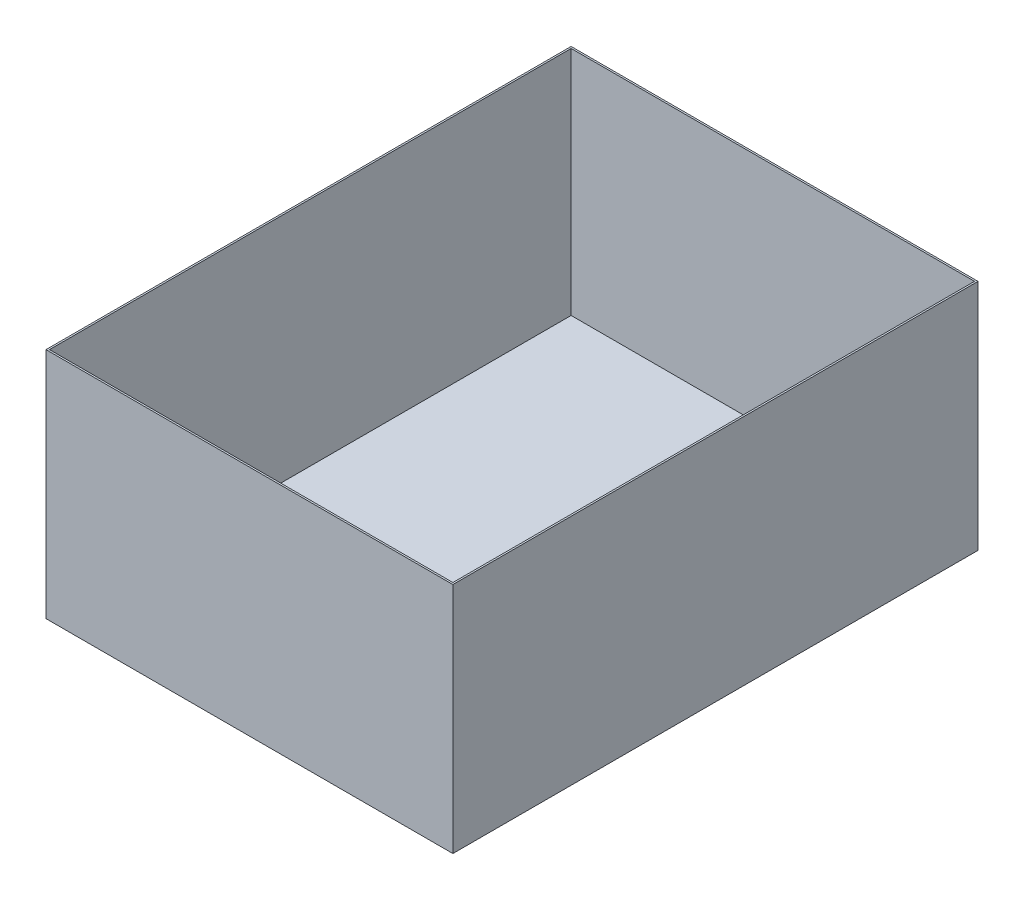
ISO-10303-21;
HEADER;
FILE_DESCRIPTION(('STEP AP214'),'2;1');
FILE_NAME('part.step','',(''),(''),'','','');
FILE_SCHEMA(('AUTOMOTIVE_DESIGN { 1 0 10303 214 1 1 1 1 }'));
ENDSEC;
DATA;
#1=APPLICATION_CONTEXT('core data for automotive mechanical design processes');
#2=APPLICATION_PROTOCOL_DEFINITION('international standard','automotive_design',2000,#1);
#3=PRODUCT_CONTEXT('',#1,'mechanical');
#4=PRODUCT('Part','Part','',(#3));
#5=PRODUCT_RELATED_PRODUCT_CATEGORY('part','',(#4));
#6=PRODUCT_DEFINITION_FORMATION('','',#4);
#7=PRODUCT_DEFINITION_CONTEXT('part definition',#1,'design');
#8=PRODUCT_DEFINITION('design','',#6,#7);
#9=PRODUCT_DEFINITION_SHAPE('','',#8);
#10=(LENGTH_UNIT() NAMED_UNIT(*) SI_UNIT(.MILLI.,.METRE.));
#11=(NAMED_UNIT(*) PLANE_ANGLE_UNIT() SI_UNIT($,.RADIAN.));
#12=(NAMED_UNIT(*) SI_UNIT($,.STERADIAN.) SOLID_ANGLE_UNIT());
#13=UNCERTAINTY_MEASURE_WITH_UNIT(LENGTH_MEASURE(1.E-05),#10,'distance_accuracy_value','');
#14=(GEOMETRIC_REPRESENTATION_CONTEXT(3) GLOBAL_UNCERTAINTY_ASSIGNED_CONTEXT((#13)) GLOBAL_UNIT_ASSIGNED_CONTEXT((#10,
#11,#12)) REPRESENTATION_CONTEXT('',''));
#15=CARTESIAN_POINT('',(0.,0.,0.));
#16=DIRECTION('',(0.,0.,1.));
#17=DIRECTION('',(1.,0.,0.));
#18=AXIS2_PLACEMENT_3D('',#15,#16,#17);
#19=CARTESIAN_POINT('',(58.5,33.5,-75.5));
#20=DIRECTION('',(-1.,0.,0.));
#21=DIRECTION('',(0.,0.,1.));
#22=AXIS2_PLACEMENT_3D('',#19,#20,#21);
#23=PLANE('',#22);
#24=DIRECTION('',(0.,0.,-1.));
#25=VECTOR('',#24,1.);
#26=CARTESIAN_POINT('',(58.5,-33.5,-75.5));
#27=LINE('',#26,#25);
#28=CARTESIAN_POINT('',(58.5,-33.5,75.5));
#29=VERTEX_POINT('',#28);
#30=CARTESIAN_POINT('',(58.5,-33.5,-75.5));
#31=VERTEX_POINT('',#30);
#32=EDGE_CURVE('E147',#29,#31,#27,.T.);
#33=ORIENTED_EDGE('',*,*,#32,.T.);
#34=DIRECTION('',(0.,-1.,0.));
#35=VECTOR('',#34,1.);
#36=CARTESIAN_POINT('',(58.5,33.5,-75.5));
#37=LINE('',#36,#35);
#38=CARTESIAN_POINT('',(58.5,33.5,-75.5));
#39=VERTEX_POINT('',#38);
#40=EDGE_CURVE('E11',#39,#31,#37,.T.);
#41=ORIENTED_EDGE('',*,*,#40,.F.);
#42=DIRECTION('',(0.,0.,-1.));
#43=VECTOR('',#42,1.);
#44=CARTESIAN_POINT('',(58.5,33.5,-75.5));
#45=LINE('',#44,#43);
#46=CARTESIAN_POINT('',(58.5,33.5,75.5));
#47=VERTEX_POINT('',#46);
#48=EDGE_CURVE('E140',#47,#39,#45,.T.);
#49=ORIENTED_EDGE('',*,*,#48,.F.);
#50=DIRECTION('',(0.,-1.,0.));
#51=VECTOR('',#50,1.);
#52=CARTESIAN_POINT('',(58.5,33.5,75.5));
#53=LINE('',#52,#51);
#54=EDGE_CURVE('E146',#47,#29,#53,.T.);
#55=ORIENTED_EDGE('',*,*,#54,.T.);
#56=EDGE_LOOP('',(#33,#41,#49,#55));
#57=FACE_BOUND('',#56,.T.);
#58=ADVANCED_FACE('F33',(#57),#23,.F.);
#59=CARTESIAN_POINT('',(-58.5,33.5,-75.5));
#60=DIRECTION('',(0.,0.,1.));
#61=DIRECTION('',(1.,0.,0.));
#62=AXIS2_PLACEMENT_3D('',#59,#60,#61);
#63=PLANE('',#62);
#64=DIRECTION('',(-1.,0.,0.));
#65=VECTOR('',#64,1.);
#66=CARTESIAN_POINT('',(-58.5,-33.5,-75.5));
#67=LINE('',#66,#65);
#68=CARTESIAN_POINT('',(-58.5,-33.5,-75.5));
#69=VERTEX_POINT('',#68);
#70=EDGE_CURVE('E150',#31,#69,#67,.T.);
#71=ORIENTED_EDGE('',*,*,#70,.T.);
#72=DIRECTION('',(0.,-1.,0.));
#73=VECTOR('',#72,1.);
#74=CARTESIAN_POINT('',(-58.5,33.5,-75.5));
#75=LINE('',#74,#73);
#76=CARTESIAN_POINT('',(-58.5,33.5,-75.5));
#77=VERTEX_POINT('',#76);
#78=EDGE_CURVE('E40',#77,#69,#75,.T.);
#79=ORIENTED_EDGE('',*,*,#78,.F.);
#80=DIRECTION('',(-1.,0.,0.));
#81=VECTOR('',#80,1.);
#82=CARTESIAN_POINT('',(-58.5,33.5,-75.5));
#83=LINE('',#82,#81);
#84=EDGE_CURVE('E84',#39,#77,#83,.T.);
#85=ORIENTED_EDGE('',*,*,#84,.F.);
#86=ORIENTED_EDGE('',*,*,#40,.T.);
#87=EDGE_LOOP('',(#71,#79,#85,#86));
#88=FACE_BOUND('',#87,.T.);
#89=ADVANCED_FACE('F179',(#88),#63,.F.);
#90=CARTESIAN_POINT('',(-58.5,33.5,-75.5));
#91=DIRECTION('',(1.,0.,0.));
#92=DIRECTION('',(0.,0.,-1.));
#93=AXIS2_PLACEMENT_3D('',#90,#91,#92);
#94=PLANE('',#93);
#95=DIRECTION('',(0.,0.,1.));
#96=VECTOR('',#95,1.);
#97=CARTESIAN_POINT('',(-58.5,-33.5,-75.5));
#98=LINE('',#97,#96);
#99=CARTESIAN_POINT('',(-58.5,-33.5,75.5));
#100=VERTEX_POINT('',#99);
#101=EDGE_CURVE('E152',#69,#100,#98,.T.);
#102=ORIENTED_EDGE('',*,*,#101,.T.);
#103=DIRECTION('',(0.,-1.,0.));
#104=VECTOR('',#103,1.);
#105=CARTESIAN_POINT('',(-58.5,33.5,75.5));
#106=LINE('',#105,#104);
#107=CARTESIAN_POINT('',(-58.5,33.5,75.5));
#108=VERTEX_POINT('',#107);
#109=EDGE_CURVE('E156',#108,#100,#106,.T.);
#110=ORIENTED_EDGE('',*,*,#109,.F.);
#111=DIRECTION('',(0.,0.,1.));
#112=VECTOR('',#111,1.);
#113=CARTESIAN_POINT('',(-58.5,33.5,-75.5));
#114=LINE('',#113,#112);
#115=EDGE_CURVE('E143',#77,#108,#114,.T.);
#116=ORIENTED_EDGE('',*,*,#115,.F.);
#117=ORIENTED_EDGE('',*,*,#78,.T.);
#118=EDGE_LOOP('',(#102,#110,#116,#117));
#119=FACE_BOUND('',#118,.T.);
#120=ADVANCED_FACE('F161',(#119),#94,.F.);
#121=CARTESIAN_POINT('',(-58.5,33.5,75.5));
#122=DIRECTION('',(0.,0.,-1.));
#123=DIRECTION('',(-1.,0.,0.));
#124=AXIS2_PLACEMENT_3D('',#121,#122,#123);
#125=PLANE('',#124);
#126=DIRECTION('',(1.,0.,0.));
#127=VECTOR('',#126,1.);
#128=CARTESIAN_POINT('',(-58.5,-33.5,75.5));
#129=LINE('',#128,#127);
#130=EDGE_CURVE('E77',#100,#29,#129,.T.);
#131=ORIENTED_EDGE('',*,*,#130,.T.);
#132=ORIENTED_EDGE('',*,*,#54,.F.);
#133=DIRECTION('',(1.,0.,0.));
#134=VECTOR('',#133,1.);
#135=CARTESIAN_POINT('',(-58.5,33.5,75.5));
#136=LINE('',#135,#134);
#137=EDGE_CURVE('E56',#108,#47,#136,.T.);
#138=ORIENTED_EDGE('',*,*,#137,.F.);
#139=ORIENTED_EDGE('',*,*,#109,.T.);
#140=EDGE_LOOP('',(#131,#132,#138,#139));
#141=FACE_BOUND('',#140,.T.);
#142=ADVANCED_FACE('F169',(#141),#125,.F.);
#143=CARTESIAN_POINT('',(0.,33.5,0.));
#144=DIRECTION('',(0.,1.,0.));
#145=DIRECTION('',(0.,0.,1.));
#146=AXIS2_PLACEMENT_3D('',#143,#144,#145);
#147=PLANE('',#146);
#148=DIRECTION('',(0.,0.,-1.));
#149=VECTOR('',#148,1.);
#150=CARTESIAN_POINT('',(58.,33.5,-75.5));
#151=LINE('',#150,#149);
#152=CARTESIAN_POINT('',(58.,33.5,75.));
#153=VERTEX_POINT('',#152);
#154=CARTESIAN_POINT('',(58.,33.5,-75.));
#155=VERTEX_POINT('',#154);
#156=EDGE_CURVE('E129',#153,#155,#151,.T.);
#157=ORIENTED_EDGE('',*,*,#156,.F.);
#158=DIRECTION('',(1.,0.,0.));
#159=VECTOR('',#158,1.);
#160=CARTESIAN_POINT('',(-58.5,33.5,75.));
#161=LINE('',#160,#159);
#162=CARTESIAN_POINT('',(-58.,33.5,75.));
#163=VERTEX_POINT('',#162);
#164=EDGE_CURVE('E138',#163,#153,#161,.T.);
#165=ORIENTED_EDGE('',*,*,#164,.F.);
#166=DIRECTION('',(0.,0.,1.));
#167=VECTOR('',#166,1.);
#168=CARTESIAN_POINT('',(-58.,33.5,-75.5));
#169=LINE('',#168,#167);
#170=CARTESIAN_POINT('',(-58.,33.5,-75.));
#171=VERTEX_POINT('',#170);
#172=EDGE_CURVE('E136',#171,#163,#169,.T.);
#173=ORIENTED_EDGE('',*,*,#172,.F.);
#174=DIRECTION('',(-1.,0.,0.));
#175=VECTOR('',#174,1.);
#176=CARTESIAN_POINT('',(-58.5,33.5,-75.));
#177=LINE('',#176,#175);
#178=EDGE_CURVE('E121',#155,#171,#177,.T.);
#179=ORIENTED_EDGE('',*,*,#178,.F.);
#180=EDGE_LOOP('',(#157,#165,#173,#179));
#181=FACE_BOUND('',#180,.T.);
#182=ORIENTED_EDGE('',*,*,#48,.T.);
#183=ORIENTED_EDGE('',*,*,#84,.T.);
#184=ORIENTED_EDGE('',*,*,#115,.T.);
#185=ORIENTED_EDGE('',*,*,#137,.T.);
#186=EDGE_LOOP('',(#182,#183,#184,#185));
#187=FACE_BOUND('',#186,.T.);
#188=ADVANCED_FACE('F171',(#181,#187),#147,.T.);
#189=CARTESIAN_POINT('',(0.,-33.5,0.));
#190=DIRECTION('',(0.,1.,0.));
#191=DIRECTION('',(0.,0.,1.));
#192=AXIS2_PLACEMENT_3D('',#189,#190,#191);
#193=PLANE('',#192);
#194=ORIENTED_EDGE('',*,*,#32,.F.);
#195=ORIENTED_EDGE('',*,*,#130,.F.);
#196=ORIENTED_EDGE('',*,*,#101,.F.);
#197=ORIENTED_EDGE('',*,*,#70,.F.);
#198=EDGE_LOOP('',(#194,#195,#196,#197));
#199=FACE_BOUND('',#198,.T.);
#200=ADVANCED_FACE('F165',(#199),#193,.F.);
#201=CARTESIAN_POINT('',(58.,33.5,-75.5));
#202=DIRECTION('',(-1.,0.,0.));
#203=DIRECTION('',(0.,0.,1.));
#204=AXIS2_PLACEMENT_3D('',#201,#202,#203);
#205=PLANE('',#204);
#206=DIRECTION('',(0.,0.,-1.));
#207=VECTOR('',#206,1.);
#208=CARTESIAN_POINT('',(58.,-33.,-75.5));
#209=LINE('',#208,#207);
#210=CARTESIAN_POINT('',(58.,-33.,75.));
#211=VERTEX_POINT('',#210);
#212=CARTESIAN_POINT('',(58.,-33.,-75.));
#213=VERTEX_POINT('',#212);
#214=EDGE_CURVE('E112',#211,#213,#209,.T.);
#215=ORIENTED_EDGE('',*,*,#214,.F.);
#216=DIRECTION('',(0.,-1.,0.));
#217=VECTOR('',#216,1.);
#218=CARTESIAN_POINT('',(58.,33.5,75.));
#219=LINE('',#218,#217);
#220=EDGE_CURVE('E132',#153,#211,#219,.T.);
#221=ORIENTED_EDGE('',*,*,#220,.F.);
#222=ORIENTED_EDGE('',*,*,#156,.T.);
#223=DIRECTION('',(0.,-1.,0.));
#224=VECTOR('',#223,1.);
#225=CARTESIAN_POINT('',(58.,33.5,-75.));
#226=LINE('',#225,#224);
#227=EDGE_CURVE('E124',#155,#213,#226,.T.);
#228=ORIENTED_EDGE('',*,*,#227,.T.);
#229=EDGE_LOOP('',(#215,#221,#222,#228));
#230=FACE_BOUND('',#229,.T.);
#231=ADVANCED_FACE('F206',(#230),#205,.T.);
#232=CARTESIAN_POINT('',(-58.5,33.5,-75.));
#233=DIRECTION('',(0.,0.,1.));
#234=DIRECTION('',(1.,0.,0.));
#235=AXIS2_PLACEMENT_3D('',#232,#233,#234);
#236=PLANE('',#235);
#237=DIRECTION('',(-1.,0.,0.));
#238=VECTOR('',#237,1.);
#239=CARTESIAN_POINT('',(-58.5,-33.,-75.));
#240=LINE('',#239,#238);
#241=CARTESIAN_POINT('',(-58.,-33.,-75.));
#242=VERTEX_POINT('',#241);
#243=EDGE_CURVE('E106',#213,#242,#240,.T.);
#244=ORIENTED_EDGE('',*,*,#243,.F.);
#245=ORIENTED_EDGE('',*,*,#227,.F.);
#246=ORIENTED_EDGE('',*,*,#178,.T.);
#247=DIRECTION('',(0.,-1.,0.));
#248=VECTOR('',#247,1.);
#249=CARTESIAN_POINT('',(-58.,33.5,-75.));
#250=LINE('',#249,#248);
#251=EDGE_CURVE('E118',#171,#242,#250,.T.);
#252=ORIENTED_EDGE('',*,*,#251,.T.);
#253=EDGE_LOOP('',(#244,#245,#246,#252));
#254=FACE_BOUND('',#253,.T.);
#255=ADVANCED_FACE('F119',(#254),#236,.T.);
#256=CARTESIAN_POINT('',(-58.,33.5,-75.5));
#257=DIRECTION('',(1.,0.,0.));
#258=DIRECTION('',(0.,0.,-1.));
#259=AXIS2_PLACEMENT_3D('',#256,#257,#258);
#260=PLANE('',#259);
#261=DIRECTION('',(0.,0.,1.));
#262=VECTOR('',#261,1.);
#263=CARTESIAN_POINT('',(-58.,-33.,-75.5));
#264=LINE('',#263,#262);
#265=CARTESIAN_POINT('',(-58.,-33.,75.));
#266=VERTEX_POINT('',#265);
#267=EDGE_CURVE('E110',#242,#266,#264,.T.);
#268=ORIENTED_EDGE('',*,*,#267,.F.);
#269=ORIENTED_EDGE('',*,*,#251,.F.);
#270=ORIENTED_EDGE('',*,*,#172,.T.);
#271=DIRECTION('',(0.,-1.,0.));
#272=VECTOR('',#271,1.);
#273=CARTESIAN_POINT('',(-58.,33.5,75.));
#274=LINE('',#273,#272);
#275=EDGE_CURVE('E47',#163,#266,#274,.T.);
#276=ORIENTED_EDGE('',*,*,#275,.T.);
#277=EDGE_LOOP('',(#268,#269,#270,#276));
#278=FACE_BOUND('',#277,.T.);
#279=ADVANCED_FACE('F126',(#278),#260,.T.);
#280=CARTESIAN_POINT('',(-58.5,33.5,75.));
#281=DIRECTION('',(0.,0.,-1.));
#282=DIRECTION('',(-1.,0.,0.));
#283=AXIS2_PLACEMENT_3D('',#280,#281,#282);
#284=PLANE('',#283);
#285=DIRECTION('',(1.,0.,0.));
#286=VECTOR('',#285,1.);
#287=CARTESIAN_POINT('',(-58.5,-33.,75.));
#288=LINE('',#287,#286);
#289=EDGE_CURVE('E127',#266,#211,#288,.T.);
#290=ORIENTED_EDGE('',*,*,#289,.F.);
#291=ORIENTED_EDGE('',*,*,#275,.F.);
#292=ORIENTED_EDGE('',*,*,#164,.T.);
#293=ORIENTED_EDGE('',*,*,#220,.T.);
#294=EDGE_LOOP('',(#290,#291,#292,#293));
#295=FACE_BOUND('',#294,.T.);
#296=ADVANCED_FACE('F236',(#295),#284,.T.);
#297=CARTESIAN_POINT('',(0.,-33.,0.));
#298=DIRECTION('',(0.,1.,0.));
#299=DIRECTION('',(0.,0.,1.));
#300=AXIS2_PLACEMENT_3D('',#297,#298,#299);
#301=PLANE('',#300);
#302=ORIENTED_EDGE('',*,*,#214,.T.);
#303=ORIENTED_EDGE('',*,*,#243,.T.);
#304=ORIENTED_EDGE('',*,*,#267,.T.);
#305=ORIENTED_EDGE('',*,*,#289,.T.);
#306=EDGE_LOOP('',(#302,#303,#304,#305));
#307=FACE_BOUND('',#306,.T.);
#308=ADVANCED_FACE('F108',(#307),#301,.T.);
#309=CLOSED_SHELL('',(#58,#89,#120,#142,#188,#200,#231,#255,#279,#296,#308));
#310=MANIFOLD_SOLID_BREP('B2',#309);
#311=ADVANCED_BREP_SHAPE_REPRESENTATION('',(#18,#310),#14);
#312=SHAPE_DEFINITION_REPRESENTATION(#9,#311);
ENDSEC;
END-ISO-10303-21;
